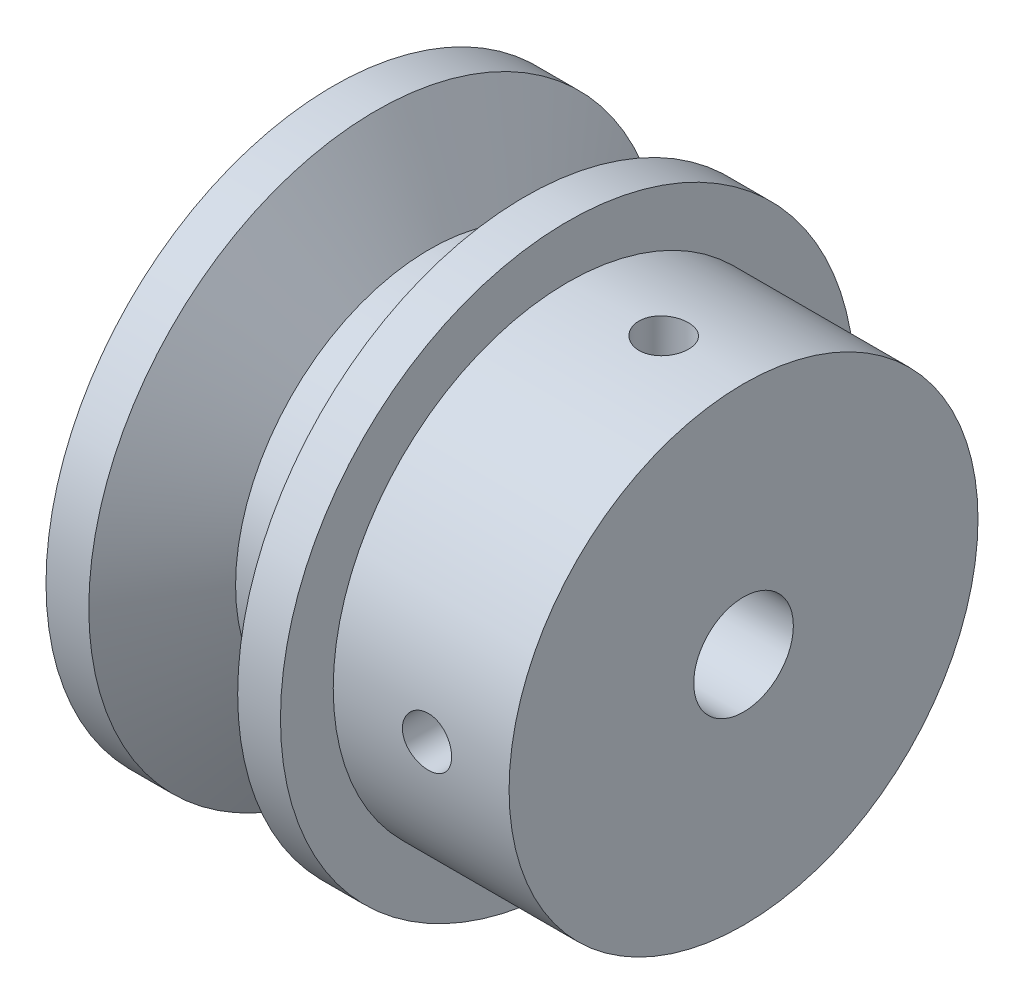
ISO-10303-21;
HEADER;
FILE_DESCRIPTION(('STEP AP214'),'2;1');
FILE_NAME('part.step','',(''),(''),'','','');
FILE_SCHEMA(('AUTOMOTIVE_DESIGN { 1 0 10303 214 1 1 1 1 }'));
ENDSEC;
DATA;
#1=APPLICATION_CONTEXT('core data for automotive mechanical design processes');
#2=APPLICATION_PROTOCOL_DEFINITION('international standard','automotive_design',2000,#1);
#3=PRODUCT_CONTEXT('',#1,'mechanical');
#4=PRODUCT('Part','Part','',(#3));
#5=PRODUCT_RELATED_PRODUCT_CATEGORY('part','',(#4));
#6=PRODUCT_DEFINITION_FORMATION('','',#4);
#7=PRODUCT_DEFINITION_CONTEXT('part definition',#1,'design');
#8=PRODUCT_DEFINITION('design','',#6,#7);
#9=PRODUCT_DEFINITION_SHAPE('','',#8);
#10=(LENGTH_UNIT() NAMED_UNIT(*) SI_UNIT(.MILLI.,.METRE.));
#11=(NAMED_UNIT(*) PLANE_ANGLE_UNIT() SI_UNIT($,.RADIAN.));
#12=(NAMED_UNIT(*) SI_UNIT($,.STERADIAN.) SOLID_ANGLE_UNIT());
#13=UNCERTAINTY_MEASURE_WITH_UNIT(LENGTH_MEASURE(1.E-05),#10,'distance_accuracy_value','');
#14=(GEOMETRIC_REPRESENTATION_CONTEXT(3) GLOBAL_UNCERTAINTY_ASSIGNED_CONTEXT((#13)) GLOBAL_UNIT_ASSIGNED_CONTEXT((#10,
#11,#12)) REPRESENTATION_CONTEXT('',''));
#15=CARTESIAN_POINT('',(0.,0.,0.));
#16=DIRECTION('',(0.,0.,1.));
#17=DIRECTION('',(1.,0.,0.));
#18=AXIS2_PLACEMENT_3D('',#15,#16,#17);
#19=CARTESIAN_POINT('',(0.,0.,0.));
#20=DIRECTION('',(-1.,0.,0.));
#21=DIRECTION('',(0.,0.,1.));
#22=AXIS2_PLACEMENT_3D('',#19,#20,#21);
#23=CYLINDRICAL_SURFACE('',#22,24.5);
#24=CARTESIAN_POINT('',(20.,0.,0.));
#25=DIRECTION('',(-1.,0.,0.));
#26=DIRECTION('',(0.,0.,1.));
#27=AXIS2_PLACEMENT_3D('',#24,#25,#26);
#28=CIRCLE('',#27,24.5);
#29=CARTESIAN_POINT('',(20.,0.,24.5));
#30=VERTEX_POINT('',#29);
#31=EDGE_CURVE('E94',#30,#30,#28,.T.);
#32=ORIENTED_EDGE('',*,*,#31,.T.);
#33=EDGE_LOOP('',(#32));
#34=FACE_BOUND('',#33,.T.);
#35=CARTESIAN_POINT('',(16.35,0.,0.));
#36=DIRECTION('',(-1.,0.,0.));
#37=DIRECTION('',(0.,0.,1.));
#38=AXIS2_PLACEMENT_3D('',#35,#36,#37);
#39=CIRCLE('',#38,24.5);
#40=CARTESIAN_POINT('',(16.35,0.,24.5));
#41=VERTEX_POINT('',#40);
#42=EDGE_CURVE('E54',#41,#41,#39,.T.);
#43=ORIENTED_EDGE('',*,*,#42,.F.);
#44=EDGE_LOOP('',(#43));
#45=FACE_BOUND('',#44,.T.);
#46=ADVANCED_FACE('F38',(#34,#45),#23,.T.);
#47=CARTESIAN_POINT('',(16.35,0.,0.));
#48=DIRECTION('',(1.,0.,0.));
#49=DIRECTION('',(0.,0.,-1.));
#50=AXIS2_PLACEMENT_3D('',#47,#48,#49);
#51=CONICAL_SURFACE('',#50,24.5,1.0471975511966);
#52=CARTESIAN_POINT('',(11.7672822383074,0.,0.));
#53=DIRECTION('',(-1.,0.,0.));
#54=DIRECTION('',(0.,0.,1.));
#55=AXIS2_PLACEMENT_3D('',#52,#53,#54);
#56=CIRCLE('',#55,16.5625);
#57=CARTESIAN_POINT('',(11.7672822383074,0.,16.5625));
#58=VERTEX_POINT('',#57);
#59=EDGE_CURVE('E112',#58,#58,#56,.T.);
#60=ORIENTED_EDGE('',*,*,#59,.F.);
#61=EDGE_LOOP('',(#60));
#62=FACE_BOUND('',#61,.T.);
#63=ORIENTED_EDGE('',*,*,#42,.T.);
#64=EDGE_LOOP('',(#63));
#65=FACE_BOUND('',#64,.T.);
#66=ADVANCED_FACE('F117',(#62,#65),#51,.T.);
#67=CARTESIAN_POINT('',(0.,0.,0.));
#68=DIRECTION('',(-1.,0.,0.));
#69=DIRECTION('',(0.,0.,1.));
#70=AXIS2_PLACEMENT_3D('',#67,#68,#69);
#71=CYLINDRICAL_SURFACE('',#70,16.5625);
#72=ORIENTED_EDGE('',*,*,#59,.T.);
#73=EDGE_LOOP('',(#72));
#74=FACE_BOUND('',#73,.T.);
#75=CARTESIAN_POINT('',(8.23271776169263,0.,0.));
#76=DIRECTION('',(-1.,0.,0.));
#77=DIRECTION('',(0.,0.,1.));
#78=AXIS2_PLACEMENT_3D('',#75,#76,#77);
#79=CIRCLE('',#78,16.5625);
#80=CARTESIAN_POINT('',(8.23271776169263,0.,16.5625));
#81=VERTEX_POINT('',#80);
#82=EDGE_CURVE('E109',#81,#81,#79,.T.);
#83=ORIENTED_EDGE('',*,*,#82,.F.);
#84=EDGE_LOOP('',(#83));
#85=FACE_BOUND('',#84,.T.);
#86=ADVANCED_FACE('F124',(#74,#85),#71,.T.);
#87=CARTESIAN_POINT('',(3.65000000000001,0.,0.));
#88=DIRECTION('',(-1.,0.,0.));
#89=DIRECTION('',(0.,0.,1.));
#90=AXIS2_PLACEMENT_3D('',#87,#88,#89);
#91=CONICAL_SURFACE('',#90,24.5,1.0471975511966);
#92=ORIENTED_EDGE('',*,*,#82,.T.);
#93=EDGE_LOOP('',(#92));
#94=FACE_BOUND('',#93,.T.);
#95=CARTESIAN_POINT('',(3.65000000000001,0.,0.));
#96=DIRECTION('',(-1.,0.,0.));
#97=DIRECTION('',(0.,0.,1.));
#98=AXIS2_PLACEMENT_3D('',#95,#96,#97);
#99=CIRCLE('',#98,24.5);
#100=CARTESIAN_POINT('',(3.65000000000001,0.,24.5));
#101=VERTEX_POINT('',#100);
#102=EDGE_CURVE('E106',#101,#101,#99,.T.);
#103=ORIENTED_EDGE('',*,*,#102,.F.);
#104=EDGE_LOOP('',(#103));
#105=FACE_BOUND('',#104,.T.);
#106=ADVANCED_FACE('F150',(#94,#105),#91,.T.);
#107=CARTESIAN_POINT('',(0.,0.,0.));
#108=DIRECTION('',(-1.,0.,0.));
#109=DIRECTION('',(0.,0.,1.));
#110=AXIS2_PLACEMENT_3D('',#107,#108,#109);
#111=CYLINDRICAL_SURFACE('',#110,24.5);
#112=ORIENTED_EDGE('',*,*,#102,.T.);
#113=EDGE_LOOP('',(#112));
#114=FACE_BOUND('',#113,.T.);
#115=CARTESIAN_POINT('',(0.,0.,0.));
#116=DIRECTION('',(-1.,0.,0.));
#117=DIRECTION('',(0.,0.,1.));
#118=AXIS2_PLACEMENT_3D('',#115,#116,#117);
#119=CIRCLE('',#118,24.5);
#120=CARTESIAN_POINT('',(0.,0.,24.5));
#121=VERTEX_POINT('',#120);
#122=EDGE_CURVE('E103',#121,#121,#119,.T.);
#123=ORIENTED_EDGE('',*,*,#122,.F.);
#124=EDGE_LOOP('',(#123));
#125=FACE_BOUND('',#124,.T.);
#126=ADVANCED_FACE('F143',(#114,#125),#111,.T.);
#127=CARTESIAN_POINT('',(0.,0.,0.));
#128=DIRECTION('',(1.,0.,0.));
#129=DIRECTION('',(0.,0.,-1.));
#130=AXIS2_PLACEMENT_3D('',#127,#128,#129);
#131=PLANE('',#130);
#132=CARTESIAN_POINT('',(0.,0.,0.));
#133=DIRECTION('',(1.,0.,0.));
#134=DIRECTION('',(0.,0.,-1.));
#135=AXIS2_PLACEMENT_3D('',#132,#133,#134);
#136=CIRCLE('',#135,4.24999999999999);
#137=CARTESIAN_POINT('',(0.,0.,-4.25));
#138=VERTEX_POINT('',#137);
#139=EDGE_CURVE('E90',#138,#138,#136,.T.);
#140=ORIENTED_EDGE('',*,*,#139,.T.);
#141=EDGE_LOOP('',(#140));
#142=FACE_BOUND('',#141,.T.);
#143=ORIENTED_EDGE('',*,*,#122,.T.);
#144=EDGE_LOOP('',(#143));
#145=FACE_BOUND('',#144,.T.);
#146=ADVANCED_FACE('F138',(#142,#145),#131,.F.);
#147=CARTESIAN_POINT('',(35.,0.,0.));
#148=DIRECTION('',(-1.,0.,0.));
#149=DIRECTION('',(0.,0.,1.));
#150=AXIS2_PLACEMENT_3D('',#147,#148,#149);
#151=PLANE('',#150);
#152=CARTESIAN_POINT('',(35.,0.,0.));
#153=DIRECTION('',(1.,0.,0.));
#154=DIRECTION('',(0.,0.,-1.));
#155=AXIS2_PLACEMENT_3D('',#152,#153,#154);
#156=CIRCLE('',#155,4.24999999999999);
#157=CARTESIAN_POINT('',(35.,0.,-4.25));
#158=VERTEX_POINT('',#157);
#159=EDGE_CURVE('E91',#158,#158,#156,.T.);
#160=ORIENTED_EDGE('',*,*,#159,.F.);
#161=EDGE_LOOP('',(#160));
#162=FACE_BOUND('',#161,.T.);
#163=CARTESIAN_POINT('',(35.,0.,0.));
#164=DIRECTION('',(-1.,0.,0.));
#165=DIRECTION('',(0.,0.,1.));
#166=AXIS2_PLACEMENT_3D('',#163,#164,#165);
#167=CIRCLE('',#166,20.);
#168=CARTESIAN_POINT('',(35.,0.,20.));
#169=VERTEX_POINT('',#168);
#170=EDGE_CURVE('E100',#169,#169,#167,.T.);
#171=ORIENTED_EDGE('',*,*,#170,.F.);
#172=EDGE_LOOP('',(#171));
#173=FACE_BOUND('',#172,.T.);
#174=ADVANCED_FACE('F134',(#162,#173),#151,.F.);
#175=CARTESIAN_POINT('',(0.,0.,0.));
#176=DIRECTION('',(-1.,0.,0.));
#177=DIRECTION('',(0.,0.,1.));
#178=AXIS2_PLACEMENT_3D('',#175,#176,#177);
#179=CYLINDRICAL_SURFACE('',#178,20.);
#180=CARTESIAN_POINT('',(30.0999999999999,0.,20.));
#181=CARTESIAN_POINT('',(30.0999949230641,-0.117610574557023,19.9999985861225));
#182=CARTESIAN_POINT('',(30.0900865495255,-0.235298131378486,19.9989515701416));
#183=CARTESIAN_POINT('',(30.0507109273297,-0.467408281963083,19.9948755007954));
#184=CARTESIAN_POINT('',(30.0212223353599,-0.581827170618716,19.9918442846144));
#185=CARTESIAN_POINT('',(29.9435561221623,-0.804005356961053,19.9841418596605));
#186=CARTESIAN_POINT('',(29.8953900254574,-0.911768713849171,19.9794716623514));
#187=CARTESIAN_POINT('',(29.7817589762976,-1.11765859904565,19.9690129744412));
#188=CARTESIAN_POINT('',(29.7162973770353,-1.21578699029521,19.9632247006673));
#189=CARTESIAN_POINT('',(29.5696564354719,-1.40003175469821,19.9511523144027));
#190=CARTESIAN_POINT('',(29.4884226842204,-1.48610471828678,19.9448665314531));
#191=CARTESIAN_POINT('',(29.3126596136441,-1.64342207671854,19.9325213225087));
#192=CARTESIAN_POINT('',(29.2181296688171,-1.71466577354691,19.9264619071801));
#193=CARTESIAN_POINT('',(29.0181837270879,-1.84045763756355,19.915238578931));
#194=CARTESIAN_POINT('',(28.9127427088116,-1.89496624010407,19.9100768004705));
#195=CARTESIAN_POINT('',(28.6941409242799,-1.98548798456528,19.9012541874174));
#196=CARTESIAN_POINT('',(28.580980367255,-2.02150162754854,19.8975933121632));
#197=CARTESIAN_POINT('',(28.3505961431443,-2.07388179744855,19.8922022962286));
#198=CARTESIAN_POINT('',(28.2333890784954,-2.09032060381397,19.890465054272));
#199=CARTESIAN_POINT('',(27.997867660402,-2.10330793490501,19.8890960255951));
#200=CARTESIAN_POINT('',(27.8795533389603,-2.0998570327374,19.8894641782095));
#201=CARTESIAN_POINT('',(27.6456751550685,-2.0732224337802,19.8922578534937));
#202=CARTESIAN_POINT('',(27.5301021784105,-2.05011778256074,19.8946751346228));
#203=CARTESIAN_POINT('',(27.3044833478822,-1.98495459652907,19.9012818323377));
#204=CARTESIAN_POINT('',(27.1944375755753,-1.94289578210747,19.9054712750661));
#205=CARTESIAN_POINT('',(26.9827480028599,-1.84093133329276,19.9151597133921));
#206=CARTESIAN_POINT('',(26.8811211529612,-1.78099076082828,19.9206612683861));
#207=CARTESIAN_POINT('',(26.6893397702596,-1.64498937257385,19.9323519192806));
#208=CARTESIAN_POINT('',(26.5991856079597,-1.56892803638551,19.9385410373734));
#209=CARTESIAN_POINT('',(26.4324495098155,-1.40240335664831,19.9509461711086));
#210=CARTESIAN_POINT('',(26.3559357115761,-1.31187177127057,19.9571621711798));
#211=CARTESIAN_POINT('',(26.2191808453472,-1.11921304858709,19.968892312137));
#212=CARTESIAN_POINT('',(26.1589397985621,-1.01708589617184,19.9744064521084));
#213=CARTESIAN_POINT('',(26.0564426844707,-0.804086871738441,19.9841136624364));
#214=CARTESIAN_POINT('',(26.0141902217919,-0.69321325233767,19.9883064679749));
#215=CARTESIAN_POINT('',(25.9489203604242,-0.465891500761115,19.9948959572163));
#216=CARTESIAN_POINT('',(25.9259023273657,-0.349443552565888,19.9972927001548));
#217=CARTESIAN_POINT('',(25.8998415045799,-0.114868577013635,20.0000123913182));
#218=CARTESIAN_POINT('',(25.896704719859,0.00324789921019204,20.0003450977804));
#219=CARTESIAN_POINT('',(25.9102483450366,0.238324864201238,19.9989254280682));
#220=CARTESIAN_POINT('',(25.9269284592535,0.355285370190057,19.997173083004));
#221=CARTESIAN_POINT('',(25.9795543943112,0.584457914380766,19.9917864257121));
#222=CARTESIAN_POINT('',(26.0154560569178,0.696680202829952,19.988156427717));
#223=CARTESIAN_POINT('',(26.1054604957931,0.913509726654044,19.9794215373593));
#224=CARTESIAN_POINT('',(26.1595637194972,1.01811677475228,19.97431660874));
#225=CARTESIAN_POINT('',(26.2846675558949,1.2171704472108,19.9631781959614));
#226=CARTESIAN_POINT('',(26.3557297509653,1.31157817667953,19.9571413566863));
#227=CARTESIAN_POINT('',(26.5126462530322,1.48715924360512,19.9448268762315));
#228=CARTESIAN_POINT('',(26.598500970121,1.56833221403392,19.9385492283796));
#229=CARTESIAN_POINT('',(26.782976275399,1.71546723142873,19.9264311606193));
#230=CARTESIAN_POINT('',(26.8816462956562,1.78136747427035,19.9205925796685));
#231=CARTESIAN_POINT('',(27.0887082401009,1.89566112087227,19.9100421218508));
#232=CARTESIAN_POINT('',(27.19710001962,1.94405478509185,19.9053302282218));
#233=CARTESIAN_POINT('',(27.4203189781472,2.02185870687178,19.8975783355786));
#234=CARTESIAN_POINT('',(27.5351333467435,2.05130538468776,19.8945351306548));
#235=CARTESIAN_POINT('',(27.7681105197298,2.09049747040502,19.8904553699828));
#236=CARTESIAN_POINT('',(27.8862732172086,2.10024350662597,19.889418750238));
#237=CARTESIAN_POINT('',(28.1219784686339,2.09974842606057,19.8894709750247));
#238=CARTESIAN_POINT('',(28.2395212407997,2.0896043940761,19.8905494954155));
#239=CARTESIAN_POINT('',(28.4712226791795,2.04982105883549,19.8946884320048));
#240=CARTESIAN_POINT('',(28.5853813421239,2.02018173674431,19.8977488501179));
#241=CARTESIAN_POINT('',(28.8070710411124,1.94227663661311,19.9055038265577));
#242=CARTESIAN_POINT('',(28.9146032094296,1.8940140510328,19.9101981047892));
#243=CARTESIAN_POINT('',(29.1200565415962,1.78024229516207,19.9206924240923));
#244=CARTESIAN_POINT('',(29.2179777270862,1.71473316370623,19.926492462674));
#245=CARTESIAN_POINT('',(29.4019269252102,1.56796388588164,19.9385787157007));
#246=CARTESIAN_POINT('',(29.487897039692,1.48663134921143,19.9448670815624));
#247=CARTESIAN_POINT('',(29.6450103088068,1.310669411452,19.9572018929493));
#248=CARTESIAN_POINT('',(29.716149918128,1.21603683994897,19.9632482803497));
#249=CARTESIAN_POINT('',(29.8417393164674,1.0158736258584,19.9744353744077));
#250=CARTESIAN_POINT('',(29.8961427555989,0.91031378094752,19.9795735493959));
#251=CARTESIAN_POINT('',(29.9863785506048,0.691568973167254,19.9883382268767));
#252=CARTESIAN_POINT('',(30.0222317076952,0.578392712609065,19.9919664216767));
#253=CARTESIAN_POINT('',(30.0654739129787,0.38715446104665,19.9963973899639));
#254=CARTESIAN_POINT('',(30.0784033405654,0.310312187595156,19.9977420180587));
#255=CARTESIAN_POINT('',(30.0956680442411,0.155657848500204,19.9995437889269));
#256=CARTESIAN_POINT('',(30.1000033603956,0.0778457873795446,20.0000009358377));
#257=CARTESIAN_POINT('',(30.0999999999999,0.,20.));
#258=B_SPLINE_CURVE_WITH_KNOTS('',3,(#180,#181,#182,#183,#184,#185,#186,#187,#188,#189,#190,
#191,#192,#193,#194,#195,#196,#197,#198,#199,#200,#201,#202,#203,#204,#205,#206,#207,#208,#209,
#210,#211,#212,#213,#214,#215,#216,#217,#218,#219,#220,#221,#222,#223,#224,#225,#226,#227,#228,
#229,#230,#231,#232,#233,#234,#235,#236,#237,#238,#239,#240,#241,#242,#243,#244,#245,#246,#247,
#248,#249,#250,#251,#252,#253,#254,#255,#256,#257),.UNSPECIFIED.,.T.,.F.,(4,2,2,2,2,2,2,2,2,2,2,
2,2,2,2,2,2,2,2,2,2,2,2,2,2,2,2,2,2,2,2,2,2,2,2,2,2,2,4),(0.,0.352547445376442,
0.705479815473187,1.05819476242908,1.41084137634119,1.76472684686613,2.11862897104475,
2.47336144998341,2.82808431805776,3.18149328120566,3.53489206119518,3.88687618772919,
4.23886550685818,4.59154711145462,4.94424010278874,5.29864833369554,5.65305702641606,
6.00753670363994,6.36200468932817,6.71479555573129,7.06758115832298,7.41955975201304,
7.77154699876233,8.12483238904223,8.47812757501256,8.83282840430146,9.18752395620731,
9.5415356525277,9.895536058047,10.2478128639806,10.6000900102609,10.9523067948681,
11.3045227863844,11.6583897165679,12.0123411437846,12.3672641737055,12.7217883461216,
12.9551386339019,13.1884878338135),.UNSPECIFIED.);
#259=CARTESIAN_POINT('',(30.0999999999999,0.,20.));
#260=VERTEX_POINT('',#259);
#261=EDGE_CURVE('E10',#260,#260,#258,.T.);
#262=ORIENTED_EDGE('',*,*,#261,.T.);
#263=EDGE_LOOP('',(#262));
#264=FACE_BOUND('',#263,.T.);
#265=CARTESIAN_POINT('',(28.0000000000001,19.9087735285796,1.90807143150495));
#266=CARTESIAN_POINT('',(27.8823914404024,19.908774922721,1.90806633908892));
#267=CARTESIAN_POINT('',(27.7647058922865,19.9097322643469,1.89814859886255));
#268=CARTESIAN_POINT('',(27.5325999151609,19.9134495882453,1.85873671185866));
#269=CARTESIAN_POINT('',(27.4181831928385,19.9162115382898,1.82922119479943));
#270=CARTESIAN_POINT('',(27.1960095875542,19.9231976900648,1.75148716343068));
#271=CARTESIAN_POINT('',(27.0882486270484,19.9274209858406,1.70328023454756));
#272=CARTESIAN_POINT('',(26.8823627582823,19.9368137874301,1.58955835083255));
#273=CARTESIAN_POINT('',(26.7842359900579,19.9419831100508,1.52404674586616));
#274=CARTESIAN_POINT('',(26.5999893976396,19.9526555393319,1.37729897479118));
#275=CARTESIAN_POINT('',(26.5139134959806,19.958159767211,1.29600773854307));
#276=CARTESIAN_POINT('',(26.3565904656832,19.9688019476405,1.12013137805806));
#277=CARTESIAN_POINT('',(26.2853440260455,19.9739398831651,1.02554563647895));
#278=CARTESIAN_POINT('',(26.159549290161,19.9832075664375,0.82549938541568));
#279=CARTESIAN_POINT('',(26.1050400558423,19.9873349512468,0.720014193101261));
#280=CARTESIAN_POINT('',(26.0145169943451,19.9940144057604,0.501338989426247));
#281=CARTESIAN_POINT('',(25.9785026735534,19.9965665175077,0.388149183786411));
#282=CARTESIAN_POINT('',(25.9261210927872,19.9997085670446,0.157725887878209));
#283=CARTESIAN_POINT('',(25.9096814922254,20.000305743927,0.0405089439525332));
#284=CARTESIAN_POINT('',(25.8966921110507,19.9993958648685,-0.195012042826543));
#285=CARTESIAN_POINT('',(25.9001417659669,19.9978888686463,-0.313316054733062));
#286=CARTESIAN_POINT('',(25.9267743868083,19.9928547803148,-0.547162053717024));
#287=CARTESIAN_POINT('',(25.9498795628102,19.9893356694535,-0.66271308547605));
#288=CARTESIAN_POINT('',(26.0150460923657,19.9805836257956,-0.888270967684079));
#289=CARTESIAN_POINT('',(26.057107713634,19.9753506687952,-0.998277739809199));
#290=CARTESIAN_POINT('',(26.1590779812326,19.963653757626,-1.20987205527494));
#291=CARTESIAN_POINT('',(26.2190209119071,19.9571874473809,-1.31144294160956));
#292=CARTESIAN_POINT('',(26.3550273370579,19.9436686675819,-1.5031052103743));
#293=CARTESIAN_POINT('',(26.4310913530884,19.9366161790682,-1.59319622125305));
#294=CARTESIAN_POINT('',(26.5976179378495,19.9226036311443,-1.7598019053934));
#295=CARTESIAN_POINT('',(26.6881482002151,19.9156441817901,-1.83624898450435));
#296=CARTESIAN_POINT('',(26.8808031513256,19.9025746183345,-1.97287842186786));
#297=CARTESIAN_POINT('',(26.9829278598462,19.8964645056816,-2.03306075237807));
#298=CARTESIAN_POINT('',(27.1959262135717,19.8857357518137,-2.13545729116324));
#299=CARTESIAN_POINT('',(27.3068019923074,19.8811174757182,-2.17766710155662));
#300=CARTESIAN_POINT('',(27.5341284387685,19.8738678498799,-2.24286926681492));
#301=CARTESIAN_POINT('',(27.650578918689,19.8712364332525,-2.2658622685892));
#302=CARTESIAN_POINT('',(27.8851550856347,19.8682510925937,-2.29189278803316));
#303=CARTESIAN_POINT('',(28.0032701456088,19.8678863755274,-2.29502487616448));
#304=CARTESIAN_POINT('',(28.2383439601977,19.8694446811826,-2.28149350748556));
#305=CARTESIAN_POINT('',(28.3553027320432,19.8713676697615,-2.26483034610807));
#306=CARTESIAN_POINT('',(28.5844665804091,19.8772885175382,-2.2122592605462));
#307=CARTESIAN_POINT('',(28.6966820947258,19.8812815335095,-2.17639625171336));
#308=CARTESIAN_POINT('',(28.913498870608,19.8909176893566,-2.08648645763982));
#309=CARTESIAN_POINT('',(29.0180999404168,19.8965608707709,-2.03243921465328));
#310=CARTESIAN_POINT('',(29.2171495161503,19.9089316457039,-1.90745487842074));
#311=CARTESIAN_POINT('',(29.3115584771322,19.9156632265894,-1.83645520544853));
#312=CARTESIAN_POINT('',(29.4871424475244,19.9294982389009,-1.67966592410564));
#313=CARTESIAN_POINT('',(29.5683170953382,19.9366016804801,-1.59387591175552));
#314=CARTESIAN_POINT('',(29.7154557708288,19.9504837206542,-1.40952519477212));
#315=CARTESIAN_POINT('',(29.7813579572652,19.9572609134405,-1.31091500867087));
#316=CARTESIAN_POINT('',(29.8956550134479,19.9697771718698,-1.1039617457929));
#317=CARTESIAN_POINT('',(29.9440501443103,19.9755162529954,-0.99561881420923));
#318=CARTESIAN_POINT('',(30.0218550287561,19.9853872270682,-0.772485579209657));
#319=CARTESIAN_POINT('',(30.0513018381394,19.9895222506179,-0.657708339958891));
#320=CARTESIAN_POINT('',(30.0904950632113,19.9958276252537,-0.424786604719663));
#321=CARTESIAN_POINT('',(30.1002420933695,19.9979980376183,-0.306642213874958));
#322=CARTESIAN_POINT('',(30.0997499263478,20.0002197681683,-0.0709457481392362));
#323=CARTESIAN_POINT('',(30.0896066111815,20.000281226215,0.0466064431085414));
#324=CARTESIAN_POINT('',(30.0498231116684,19.9983988252036,0.278346083950315));
#325=CARTESIAN_POINT('',(30.0201829164929,19.9964549650316,0.392533531675448));
#326=CARTESIAN_POINT('',(29.9422742718292,19.9908716828309,0.614296917725034));
#327=CARTESIAN_POINT('',(29.8940089643425,19.9872325467688,0.721873967657565));
#328=CARTESIAN_POINT('',(29.7802302840481,19.9787505641627,0.927427091273511));
#329=CARTESIAN_POINT('',(29.7147169553952,19.9739077207003,1.02540318953438));
#330=CARTESIAN_POINT('',(29.567943044039,19.9636108107169,1.20946008920355));
#331=CARTESIAN_POINT('',(29.486611032137,19.9581540208986,1.29548377949989));
#332=CARTESIAN_POINT('',(29.3106514034335,19.9473276852828,1.4527028603051));
#333=CARTESIAN_POINT('',(29.2160206093185,19.9419581606773,1.5238946971026));
#334=CARTESIAN_POINT('',(29.0158588605746,19.9319560879982,1.64958329910245));
#335=CARTESIAN_POINT('',(28.9102983831634,19.9273256266457,1.70403318140654));
#336=CARTESIAN_POINT('',(28.6915522373686,19.9193973089059,1.79434806839811));
#337=CARTESIAN_POINT('',(28.5783752755783,19.9160979600974,1.83023389960541));
#338=CARTESIAN_POINT('',(28.3871392066475,19.9120622356336,1.87351475421881));
#339=CARTESIAN_POINT('',(28.310299978641,19.9108352822219,1.88645558771616));
#340=CARTESIAN_POINT('',(28.1556517398507,19.9091904692412,1.9037355911949));
#341=CARTESIAN_POINT('',(28.0778427336795,19.9087726058255,1.90807480207243));
#342=CARTESIAN_POINT('',(28.0000000000001,19.9087735285796,1.90807143150495));
#343=B_SPLINE_CURVE_WITH_KNOTS('',3,(#265,#266,#267,#268,#269,#270,#271,#272,#273,#274,#275,
#276,#277,#278,#279,#280,#281,#282,#283,#284,#285,#286,#287,#288,#289,#290,#291,#292,#293,#294,
#295,#296,#297,#298,#299,#300,#301,#302,#303,#304,#305,#306,#307,#308,#309,#310,#311,#312,#313,
#314,#315,#316,#317,#318,#319,#320,#321,#322,#323,#324,#325,#326,#327,#328,#329,#330,#331,#332,
#333,#334,#335,#336,#337,#338,#339,#340,#341,#342),.UNSPECIFIED.,.T.,.F.,(4,2,2,2,2,2,2,2,2,2,2,
2,2,2,2,2,2,2,2,2,2,2,2,2,2,2,2,2,2,2,2,2,2,2,2,2,2,2,4),(0.,0.352541392757038,
0.705467844949072,1.05817589288431,1.41081571303364,1.76470910446591,2.11861893468595,
2.47334856290649,2.82806872320948,3.18147386566253,3.53486897828233,3.88687194438131,
4.23887988184117,4.59156712019775,4.94426577053852,5.29866597082378,5.65306677559635,
6.00755425259251,6.36202979573875,6.71481617956408,7.06759729832104,7.41955671839273,
7.77152499888808,8.12481322079793,8.47811109385865,8.8328154741928,9.18751456392706,
9.54151787022173,9.89551013438075,10.2478001625514,10.6000903863889,10.9523212058687,
11.3045511236501,11.6584100936316,12.0123537509446,12.3672797231228,12.7218066449305,
12.9551477921905,13.1884878300348),.UNSPECIFIED.);
#344=CARTESIAN_POINT('',(28.0000000000001,19.9087735285796,1.90807143150495));
#345=VERTEX_POINT('',#344);
#346=EDGE_CURVE('E50',#345,#345,#343,.T.);
#347=ORIENTED_EDGE('',*,*,#346,.T.);
#348=EDGE_LOOP('',(#347));
#349=FACE_BOUND('',#348,.T.);
#350=CARTESIAN_POINT('',(20.,0.,0.));
#351=DIRECTION('',(-1.,0.,0.));
#352=DIRECTION('',(0.,0.,1.));
#353=AXIS2_PLACEMENT_3D('',#350,#351,#352);
#354=CIRCLE('',#353,20.);
#355=CARTESIAN_POINT('',(20.,0.,20.));
#356=VERTEX_POINT('',#355);
#357=EDGE_CURVE('E97',#356,#356,#354,.T.);
#358=ORIENTED_EDGE('',*,*,#357,.F.);
#359=EDGE_LOOP('',(#358));
#360=FACE_BOUND('',#359,.T.);
#361=ORIENTED_EDGE('',*,*,#170,.T.);
#362=EDGE_LOOP('',(#361));
#363=FACE_BOUND('',#362,.T.);
#364=ADVANCED_FACE('F65',(#264,#349,#360,#363),#179,.T.);
#365=CARTESIAN_POINT('',(20.,0.,0.));
#366=DIRECTION('',(-1.,0.,0.));
#367=DIRECTION('',(0.,0.,1.));
#368=AXIS2_PLACEMENT_3D('',#365,#366,#367);
#369=PLANE('',#368);
#370=ORIENTED_EDGE('',*,*,#31,.F.);
#371=EDGE_LOOP('',(#370));
#372=FACE_BOUND('',#371,.T.);
#373=ORIENTED_EDGE('',*,*,#357,.T.);
#374=EDGE_LOOP('',(#373));
#375=FACE_BOUND('',#374,.T.);
#376=ADVANCED_FACE('F79',(#372,#375),#369,.F.);
#377=CARTESIAN_POINT('',(28.0000000000001,19.99906974527,-0.192897184592838));
#378=DIRECTION('',(0.,0.999953487263504,-0.0096448592296486));
#379=DIRECTION('',(0.,0.0096448592296486,0.999953487263504));
#380=AXIS2_PLACEMENT_3D('',#377,#378,#379);
#381=CYLINDRICAL_SURFACE('',#380,2.09999999999999);
#382=CARTESIAN_POINT('',(28.,3.71501130049379,2.06426525359604));
#383=CARTESIAN_POINT('',(27.890377210422,3.71502158360015,2.06425653751235));
#384=CARTESIAN_POINT('',(27.7806072251844,3.71988058636931,2.05557646931051));
#385=CARTESIAN_POINT('',(27.5644226061151,3.73861359116427,2.0212929786709));
#386=CARTESIAN_POINT('',(27.4580157052991,3.75250698023121,1.99565315997792));
#387=CARTESIAN_POINT('',(27.2520875557836,3.78728352333668,1.92882888816316));
#388=CARTESIAN_POINT('',(27.15253352879,3.80813013981902,1.88772555065562));
#389=CARTESIAN_POINT('',(26.9617251701866,3.85437603792173,1.79140465572277));
#390=CARTESIAN_POINT('',(26.8704711189521,3.87977547325146,1.73618662173925));
#391=CARTESIAN_POINT('',(26.690742165389,3.93472103014329,1.6080131476099));
#392=CARTESIAN_POINT('',(26.603081376712,3.96443636203658,1.53398815780962));
#393=CARTESIAN_POINT('',(26.4407396268126,4.02317658264842,1.37256296825737));
#394=CARTESIAN_POINT('',(26.3660650121937,4.05220112781826,1.28515626761307));
#395=CARTESIAN_POINT('',(26.2270347811473,4.10849036082869,1.09247970735445));
#396=CARTESIAN_POINT('',(26.1636744685528,4.13551552199013,0.986415115003751));
#397=CARTESIAN_POINT('',(26.056022102955,4.18239374787786,0.763552147953959));
#398=CARTESIAN_POINT('',(26.0117182918848,4.20225123391689,0.646760446143181));
#399=CARTESIAN_POINT('',(25.946640469456,4.23125299296168,0.414407719218791));
#400=CARTESIAN_POINT('',(25.9244405884697,4.24104799939455,0.299329232981755));
#401=CARTESIAN_POINT('',(25.8995115975526,4.2510675809692,0.0666939956024535));
#402=CARTESIAN_POINT('',(25.8967710211596,4.25129779258733,-0.0508612551282576));
#403=CARTESIAN_POINT('',(25.9102732175132,4.24248135296876,-0.274422207033233));
#404=CARTESIAN_POINT('',(25.9249226763912,4.23422133725775,-0.38056049731084));
#405=CARTESIAN_POINT('',(25.9699468177184,4.21034999290209,-0.588570583156537));
#406=CARTESIAN_POINT('',(26.0003226747154,4.19473811518133,-0.690442059437367));
#407=CARTESIAN_POINT('',(26.0761518853997,4.15726085663201,-0.888834824496624));
#408=CARTESIAN_POINT('',(26.1218115018908,4.135310524113,-0.985260590706208));
#409=CARTESIAN_POINT('',(26.2266360571766,4.08709680153745,-1.16927364695044));
#410=CARTESIAN_POINT('',(26.2858058657789,4.06083185722033,-1.25685773350622));
#411=CARTESIAN_POINT('',(26.4222905963279,4.00354190612555,-1.42939256548392));
#412=CARTESIAN_POINT('',(26.5007803983948,3.97230136442537,-1.5133431601462));
#413=CARTESIAN_POINT('',(26.6705231645149,3.91013163806929,-1.66741932630418));
#414=CARTESIAN_POINT('',(26.7617854660575,3.87920269910857,-1.73753469219453));
#415=CARTESIAN_POINT('',(26.9613026168058,3.81907562614396,-1.86614801873884));
#416=CARTESIAN_POINT('',(27.0702539790572,3.79009774009957,-1.92367794951799));
#417=CARTESIAN_POINT('',(27.2980726671251,3.74007400462317,-2.01922877453023));
#418=CARTESIAN_POINT('',(27.4169297020719,3.71902004556199,-2.05726962906551));
#419=CARTESIAN_POINT('',(27.6513406210099,3.68949165291765,-2.10973869372773));
#420=CARTESIAN_POINT('',(27.7664195950569,3.68015839235957,-2.12578812204307));
#421=CARTESIAN_POINT('',(27.997980636463,3.67266568000019,-2.13871397562137));
#422=CARTESIAN_POINT('',(28.1144617126732,3.67449875011144,-2.13560323242847));
#423=CARTESIAN_POINT('',(28.3324168485009,3.68822655710521,-2.11178244283596));
#424=CARTESIAN_POINT('',(28.4341767036044,3.69903831564602,-2.09296561573764));
#425=CARTESIAN_POINT('',(28.6328927944235,3.72793618462255,-2.04104572635484));
#426=CARTESIAN_POINT('',(28.729847508605,3.74602458286355,-2.00793817076774));
#427=CARTESIAN_POINT('',(28.921311527187,3.78845057573948,-1.92673936602538));
#428=CARTESIAN_POINT('',(29.0154985277137,3.81303922832507,-1.87802405152124));
#429=CARTESIAN_POINT('',(29.1948616960529,3.86550222852553,-1.7675213251778));
#430=CARTESIAN_POINT('',(29.2800332184499,3.89337825454048,-1.7057272229307));
#431=CARTESIAN_POINT('',(29.4498617532575,3.95342963793854,-1.56194538640159));
#432=CARTESIAN_POINT('',(29.5331771865681,3.98571329595591,-1.47841112444342));
#433=CARTESIAN_POINT('',(29.684963835272,4.0480578314216,-1.29801129968115));
#434=CARTESIAN_POINT('',(29.7534304047344,4.07811801125241,-1.20114157991553));
#435=CARTESIAN_POINT('',(29.8749435487262,4.13365947880274,-0.993560261732785));
#436=CARTESIAN_POINT('',(29.927579000057,4.15901304121537,-0.882571466693287));
#437=CARTESIAN_POINT('',(30.0128737952624,4.20137168352102,-0.65169296100754));
#438=CARTESIAN_POINT('',(30.0455502734609,4.21838392176847,-0.531810984401675));
#439=CARTESIAN_POINT('',(30.0872445713947,4.24099795272733,-0.298236541993713));
#440=CARTESIAN_POINT('',(30.0981334577348,4.24749192308113,-0.18496368211018));
#441=CARTESIAN_POINT('',(30.1014235600151,4.25130552683457,0.0419884520583656));
#442=CARTESIAN_POINT('',(30.0938309426715,4.24862822028913,0.155667578146014));
#443=CARTESIAN_POINT('',(30.0616283541212,4.23494161646806,0.372622256616552));
#444=CARTESIAN_POINT('',(30.0381274879921,4.22447117749555,0.476100525546987));
#445=CARTESIAN_POINT('',(29.9762485536345,4.19687581778885,0.677552276467021));
#446=CARTESIAN_POINT('',(29.9378683034506,4.17974992107844,0.775524948686524));
#447=CARTESIAN_POINT('',(29.8455712262595,4.13952526918212,0.967942367923831));
#448=CARTESIAN_POINT('',(29.7910524110192,4.11619955242158,1.06204947316902));
#449=CARTESIAN_POINT('',(29.6687899638842,4.06607405736775,1.24020997991871));
#450=CARTESIAN_POINT('',(29.6010402433098,4.03927268153912,1.32425872387528));
#451=CARTESIAN_POINT('',(29.4465654848967,3.98184288814479,1.48852816907666));
#452=CARTESIAN_POINT('',(29.3586347119445,3.95109603884772,1.56757774306322));
#453=CARTESIAN_POINT('',(29.1703261601814,3.89149332338362,1.71019468853705));
#454=CARTESIAN_POINT('',(29.0699379144373,3.86263907894691,1.77374890588513));
#455=CARTESIAN_POINT('',(28.8556094980655,3.80961063790963,1.88501984443124));
#456=CARTESIAN_POINT('',(28.7413679724469,3.78559058570856,1.93224180647682));
#457=CARTESIAN_POINT('',(28.5643184708577,3.7566630053114,1.98756255412952));
#458=CARTESIAN_POINT('',(28.5044111560225,3.74820869855937,2.0034100538119));
#459=CARTESIAN_POINT('',(28.3831331294541,3.73400417309598,2.02976370162798));
#460=CARTESIAN_POINT('',(28.3217634814382,3.72825204829646,2.04027361525926));
#461=CARTESIAN_POINT('',(28.2169191689989,3.72101957070331,2.05342403677501));
#462=CARTESIAN_POINT('',(28.1736692847043,3.71877245508102,2.05748504892645));
#463=CARTESIAN_POINT('',(28.0869539980406,3.7157662318328,2.06290747408788));
#464=CARTESIAN_POINT('',(28.0434885818268,3.71500722107094,2.06426871136354));
#465=CARTESIAN_POINT('',(28.,3.71501130049379,2.06426525359604));
#466=B_SPLINE_CURVE_WITH_KNOTS('',3,(#382,#383,#384,#385,#386,#387,#388,#389,#390,#391,#392,
#393,#394,#395,#396,#397,#398,#399,#400,#401,#402,#403,#404,#405,#406,#407,#408,#409,#410,#411,
#412,#413,#414,#415,#416,#417,#418,#419,#420,#421,#422,#423,#424,#425,#426,#427,#428,#429,#430,
#431,#432,#433,#434,#435,#436,#437,#438,#439,#440,#441,#442,#443,#444,#445,#446,#447,#448,#449,
#450,#451,#452,#453,#454,#455,#456,#457,#458,#459,#460,#461,#462,#463,#464,#465),.UNSPECIFIED.,
.T.,.F.,(4,2,2,2,2,2,2,2,2,2,2,2,2,2,2,2,2,2,2,2,2,2,2,2,2,2,2,2,2,2,2,2,2,2,2,2,2,2,2,2,2,4),
(0.,0.328692861111129,0.658093407863863,0.985789609296073,1.31349687628274,1.66756662438675,
2.02180893012455,2.39923712758497,2.77643211255492,3.12731324879109,3.47798760993834,
3.79886355370599,4.11976346599583,4.44518150362486,4.77071702529913,5.12648837037186,
5.48252117833451,5.8602449556919,6.23758109902283,6.58525264610167,6.93269138328511,
7.24343975501124,7.55428590374875,7.87955795510363,8.20499680213587,8.57030870286877,
8.93573473847187,9.30996237325344,9.68386828893405,10.0239865629283,10.3639913653501,
10.6824458037171,11.0009469588271,11.3332708632137,11.6657480603787,12.0306237683759,
12.3958081523161,12.7712456082731,12.9586238517765,13.1458697216088,13.2762573543191,
13.4066534739704),.UNSPECIFIED.);
#467=CARTESIAN_POINT('',(28.,3.71501130049379,2.06426525359604));
#468=VERTEX_POINT('',#467);
#469=EDGE_CURVE('E83',#468,#468,#466,.T.);
#470=ORIENTED_EDGE('',*,*,#469,.T.);
#471=EDGE_LOOP('',(#470));
#472=FACE_BOUND('',#471,.T.);
#473=ORIENTED_EDGE('',*,*,#346,.F.);
#474=EDGE_LOOP('',(#473));
#475=FACE_BOUND('',#474,.T.);
#476=ADVANCED_FACE('F73',(#472,#475),#381,.F.);
#477=CARTESIAN_POINT('',(27.9999999999999,0.,20.));
#478=DIRECTION('',(0.,0.,1.));
#479=DIRECTION('',(1.,0.,0.));
#480=AXIS2_PLACEMENT_3D('',#477,#478,#479);
#481=CYLINDRICAL_SURFACE('',#480,2.09999999999999);
#482=CARTESIAN_POINT('',(30.1,-1.38777878078145E-13,4.25000000000003));
#483=CARTESIAN_POINT('',(30.099993173995,-0.110556303358868,4.24999410772438));
#484=CARTESIAN_POINT('',(30.0912181636213,-0.221249036358233,4.24563960335715));
#485=CARTESIAN_POINT('',(30.0565015761234,-0.439372728289634,4.22864969313591));
#486=CARTESIAN_POINT('',(30.0305263925991,-0.546796870279397,4.21599807651142));
#487=CARTESIAN_POINT('',(29.9626682008808,-0.75489323220647,4.18374019464113));
#488=CARTESIAN_POINT('',(29.920846524732,-0.855589745063791,4.16416076181372));
#489=CARTESIAN_POINT('',(29.8227950391742,-1.04839235535414,4.11985107782534));
#490=CARTESIAN_POINT('',(29.7665665876814,-1.14049926128848,4.09512131215209));
#491=CARTESIAN_POINT('',(29.6374889715676,-1.31967279343066,4.04106838263255));
#492=CARTESIAN_POINT('',(29.5638500563674,-1.40611363338115,4.01155948094383));
#493=CARTESIAN_POINT('',(29.4037391703026,-1.56599238758367,3.95189365333133));
#494=CARTESIAN_POINT('',(29.3172577524391,-1.63942064176539,3.92173626446273));
#495=CARTESIAN_POINT('',(29.1261020504007,-1.77672701951704,3.86157698249693));
#496=CARTESIAN_POINT('',(29.0205483198023,-1.83947014763542,3.83175768526644));
#497=CARTESIAN_POINT('',(28.7987517998703,-1.94604792933966,3.77875168390647));
#498=CARTESIAN_POINT('',(28.6825165821903,-1.98989585339632,3.75556032871184));
#499=CARTESIAN_POINT('',(28.4496940166941,-2.05462572634016,3.72052473890272));
#500=CARTESIAN_POINT('',(28.3335354538438,-2.07671431515273,3.70808968108115));
#501=CARTESIAN_POINT('',(28.0985502736475,-2.10100060814597,3.69438949659643));
#502=CARTESIAN_POINT('',(27.9797262905706,-2.10321715289095,3.6931137898482));
#503=CARTESIAN_POINT('',(27.757608300255,-2.08858300285657,3.70139904057684));
#504=CARTESIAN_POINT('',(27.6541129781072,-2.07391623247164,3.70971900279345));
#505=CARTESIAN_POINT('',(27.4513023599258,-2.02970634826815,3.73408927918673));
#506=CARTESIAN_POINT('',(27.3519883543535,-2.00015867776722,3.75014196113496));
#507=CARTESIAN_POINT('',(27.1575302783304,-1.92647747338613,3.78852694172313));
#508=CARTESIAN_POINT('',(27.0625374675893,-1.88201985439038,3.81099695601811));
#509=CARTESIAN_POINT('',(26.8809090684613,-1.78002709499905,3.85968828961006));
#510=CARTESIAN_POINT('',(26.7942772507376,-1.72248609311855,3.88591128832395));
#511=CARTESIAN_POINT('',(26.6205707752944,-1.58767280279818,3.94306809408522));
#512=CARTESIAN_POINT('',(26.5347616434586,-1.50884162369177,3.97418382003242));
#513=CARTESIAN_POINT('',(26.377061722174,-1.33776426389462,4.03498810518279));
#514=CARTESIAN_POINT('',(26.3051772892247,-1.245511990084,4.06467600797096));
#515=CARTESIAN_POINT('',(26.1743803179307,-1.04501442194774,4.12089102765809));
#516=CARTESIAN_POINT('',(26.11618484595,-0.936241140223498,4.14721945857502));
#517=CARTESIAN_POINT('',(26.0193896753544,-0.708816842128024,4.19207213604325));
#518=CARTESIAN_POINT('',(25.9807747608579,-0.590173579354815,4.21060244054051));
#519=CARTESIAN_POINT('',(25.927350372904,-0.356749311425304,4.23649382228911));
#520=CARTESIAN_POINT('',(25.9108569912378,-0.242441815606446,4.24464222716031));
#521=CARTESIAN_POINT('',(25.89688206874,-0.0124076012943247,4.25153643122761));
#522=CARTESIAN_POINT('',(25.8993918326134,0.103318443912716,4.25028653082076));
#523=CARTESIAN_POINT('',(25.9223580050096,0.323645377568909,4.2389874149645));
#524=CARTESIAN_POINT('',(25.9414488496158,0.42842783008848,4.22960785094671));
#525=CARTESIAN_POINT('',(25.9949120673616,0.633098148833699,4.20384711116728));
#526=CARTESIAN_POINT('',(26.0292861431365,0.732985468337913,4.18746515530882));
#527=CARTESIAN_POINT('',(26.1132714399845,0.928383736098344,4.14859272633633));
#528=CARTESIAN_POINT('',(26.1632965194656,1.02368308049828,4.12593853688358));
#529=CARTESIAN_POINT('',(26.2767009564321,1.20485501400331,4.07672066447709));
#530=CARTESIAN_POINT('',(26.340086057075,1.2907235247911,4.05015530168782));
#531=CARTESIAN_POINT('',(26.48547151745,1.45937102404195,3.99267049363668));
#532=CARTESIAN_POINT('',(26.5686774934635,1.54105377811858,3.96157820256399));
#533=CARTESIAN_POINT('',(26.7477198105969,1.68977840302566,3.90046500905865));
#534=CARTESIAN_POINT('',(26.8435643197806,1.75681073044845,3.87044481558631));
#535=CARTESIAN_POINT('',(27.050686592162,1.87717442359438,3.81357505932862));
#536=CARTESIAN_POINT('',(27.1624673645949,1.92974592351379,3.78693122358611));
#537=CARTESIAN_POINT('',(27.395033452648,2.01476877575857,3.74239834110085));
#538=CARTESIAN_POINT('',(27.5158072211066,2.04724544760697,3.72449828319597));
#539=CARTESIAN_POINT('',(27.7506176341396,2.08821208466025,3.70167136082868));
#540=CARTESIAN_POINT('',(27.8642010013601,2.09869132804825,3.69567163372624));
#541=CARTESIAN_POINT('',(28.0916066454029,2.1010761711582,3.69431841676652));
#542=CARTESIAN_POINT('',(28.205428808176,2.09298921622542,3.69896065930649));
#543=CARTESIAN_POINT('',(28.4191721421235,2.06031975915655,3.71724005716936));
#544=CARTESIAN_POINT('',(28.5194155367936,2.03730586120503,3.73001993656797));
#545=CARTESIAN_POINT('',(28.7145203110766,1.97734260749313,3.76214915317573));
#546=CARTESIAN_POINT('',(28.809379978559,1.94038884683743,3.78150056674889));
#547=CARTESIAN_POINT('',(28.9980765062985,1.85080461902616,3.82618379354453));
#548=CARTESIAN_POINT('',(29.0914155099012,1.79728696926056,3.85183028637355));
#549=CARTESIAN_POINT('',(29.2683930428075,1.67709119176058,3.90566263288376));
#550=CARTESIAN_POINT('',(29.352026560155,1.61040631200413,3.933849785342));
#551=CARTESIAN_POINT('',(29.517442454207,1.45656351442924,3.99355696582301));
#552=CARTESIAN_POINT('',(29.5978500521655,1.36792010242947,4.0250790490399));
#553=CARTESIAN_POINT('',(29.7429407124462,1.17749087845077,4.08484591677573));
#554=CARTESIAN_POINT('',(29.8076155255033,1.07569821448677,4.11308897794603));
#555=CARTESIAN_POINT('',(29.9193197953652,0.860781430076301,4.16338652853702));
#556=CARTESIAN_POINT('',(29.9662675600364,0.747607820729552,4.18541225162931));
#557=CARTESIAN_POINT('',(30.0398624489496,0.513710050061847,4.22048316405325));
#558=CARTESIAN_POINT('',(30.0665677949657,0.393008632559149,4.23355409887148));
#559=CARTESIAN_POINT('',(30.0883046313737,0.225925588147322,4.2442315569069));
#560=CARTESIAN_POINT('',(30.0926844787957,0.180887268849418,4.24638934045654));
#561=CARTESIAN_POINT('',(30.098533601169,0.0905736051995723,4.24927478860685));
#562=CARTESIAN_POINT('',(30.1000027968203,0.0452982544234619,4.25000241424321));
#563=CARTESIAN_POINT('',(30.1,-1.38777878078145E-13,4.25000000000003));
#564=B_SPLINE_CURVE_WITH_KNOTS('',3,(#482,#483,#484,#485,#486,#487,#488,#489,#490,#491,#492,
#493,#494,#495,#496,#497,#498,#499,#500,#501,#502,#503,#504,#505,#506,#507,#508,#509,#510,#511,
#512,#513,#514,#515,#516,#517,#518,#519,#520,#521,#522,#523,#524,#525,#526,#527,#528,#529,#530,
#531,#532,#533,#534,#535,#536,#537,#538,#539,#540,#541,#542,#543,#544,#545,#546,#547,#548,#549,
#550,#551,#552,#553,#554,#555,#556,#557,#558,#559,#560,#561,#562,#563),.UNSPECIFIED.,.T.,.F.,(4,
2,2,2,2,2,2,2,2,2,2,2,2,2,2,2,2,2,2,2,2,2,2,2,2,2,2,2,2,2,2,2,2,2,2,2,2,2,2,2,4),(0.,
0.331484886424043,0.66361936015326,0.994481262931501,1.32531199165844,1.67582318164293,
2.026593498193,2.40376874780474,2.78067866642621,3.13526013438047,3.48950539020593,
3.80262095487285,4.11583245704644,4.43634832337415,4.75700806790448,5.11725224791606,
5.47766049060283,5.85405976280553,6.2301660884134,6.57561427828729,6.92090441052147,
7.24019511934129,7.55952140780487,7.88812961705784,8.21687937637363,8.57732783774419,
8.93801040296221,9.31506208314771,9.69163770482401,10.032361612141,10.3729489075376,
10.6825324980872,10.9922139968606,11.3227230166197,11.6534019602707,12.0229757094664,
12.3927428237963,12.7641937337792,13.1345721699577,13.2703878329718,13.4062071961979),.UNSPECIFIED.);
#565=CARTESIAN_POINT('',(30.1,-1.38777878078145E-13,4.25000000000003));
#566=VERTEX_POINT('',#565);
#567=EDGE_CURVE('E41',#566,#566,#564,.T.);
#568=ORIENTED_EDGE('',*,*,#567,.T.);
#569=EDGE_LOOP('',(#568));
#570=FACE_BOUND('',#569,.T.);
#571=ORIENTED_EDGE('',*,*,#261,.F.);
#572=EDGE_LOOP('',(#571));
#573=FACE_BOUND('',#572,.T.);
#574=ADVANCED_FACE('F69',(#570,#573),#481,.F.);
#575=CARTESIAN_POINT('',(35.,0.,0.));
#576=DIRECTION('',(1.,0.,0.));
#577=DIRECTION('',(0.,0.,-1.));
#578=AXIS2_PLACEMENT_3D('',#575,#576,#577);
#579=CYLINDRICAL_SURFACE('',#578,4.24999999999999);
#580=ORIENTED_EDGE('',*,*,#469,.F.);
#581=EDGE_LOOP('',(#580));
#582=FACE_BOUND('',#581,.T.);
#583=ORIENTED_EDGE('',*,*,#159,.T.);
#584=EDGE_LOOP('',(#583));
#585=FACE_BOUND('',#584,.T.);
#586=ORIENTED_EDGE('',*,*,#567,.F.);
#587=EDGE_LOOP('',(#586));
#588=FACE_BOUND('',#587,.T.);
#589=ORIENTED_EDGE('',*,*,#139,.F.);
#590=EDGE_LOOP('',(#589));
#591=FACE_BOUND('',#590,.T.);
#592=ADVANCED_FACE('F72',(#582,#585,#588,#591),#579,.F.);
#593=CLOSED_SHELL('',(#46,#66,#86,#106,#126,#146,#174,#364,#376,#476,#574,#592));
#594=MANIFOLD_SOLID_BREP('B2',#593);
#595=ADVANCED_BREP_SHAPE_REPRESENTATION('',(#18,#594),#14);
#596=SHAPE_DEFINITION_REPRESENTATION(#9,#595);
ENDSEC;
END-ISO-10303-21;
